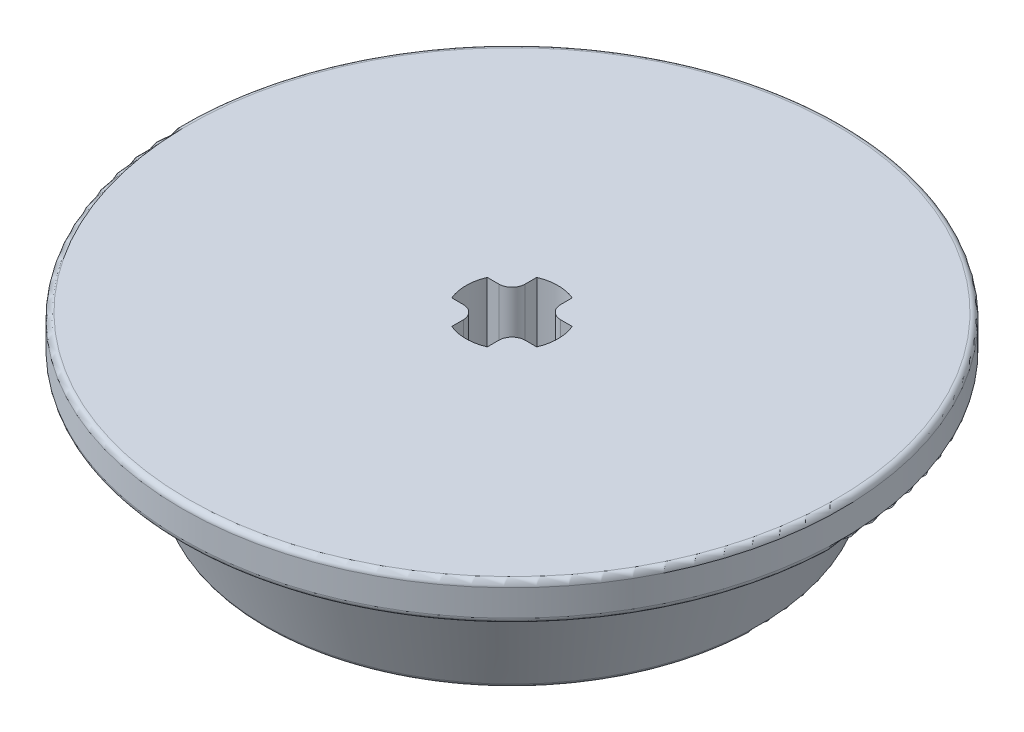
ISO-10303-21;
HEADER;
FILE_DESCRIPTION(('STEP AP214'),'2;1');
FILE_NAME('part.step','',(''),(''),'','','');
FILE_SCHEMA(('AUTOMOTIVE_DESIGN { 1 0 10303 214 1 1 1 1 }'));
ENDSEC;
DATA;
#1=APPLICATION_CONTEXT('core data for automotive mechanical design processes');
#2=APPLICATION_PROTOCOL_DEFINITION('international standard','automotive_design',2000,#1);
#3=PRODUCT_CONTEXT('',#1,'mechanical');
#4=PRODUCT('Part','Part','',(#3));
#5=PRODUCT_RELATED_PRODUCT_CATEGORY('part','',(#4));
#6=PRODUCT_DEFINITION_FORMATION('','',#4);
#7=PRODUCT_DEFINITION_CONTEXT('part definition',#1,'design');
#8=PRODUCT_DEFINITION('design','',#6,#7);
#9=PRODUCT_DEFINITION_SHAPE('','',#8);
#10=(LENGTH_UNIT() NAMED_UNIT(*) SI_UNIT(.MILLI.,.METRE.));
#11=(NAMED_UNIT(*) PLANE_ANGLE_UNIT() SI_UNIT($,.RADIAN.));
#12=(NAMED_UNIT(*) SI_UNIT($,.STERADIAN.) SOLID_ANGLE_UNIT());
#13=UNCERTAINTY_MEASURE_WITH_UNIT(LENGTH_MEASURE(1.E-05),#10,'distance_accuracy_value','');
#14=(GEOMETRIC_REPRESENTATION_CONTEXT(3) GLOBAL_UNCERTAINTY_ASSIGNED_CONTEXT((#13)) GLOBAL_UNIT_ASSIGNED_CONTEXT((#10,
#11,#12)) REPRESENTATION_CONTEXT('',''));
#15=CARTESIAN_POINT('',(0.,0.,0.));
#16=DIRECTION('',(0.,0.,1.));
#17=DIRECTION('',(1.,0.,0.));
#18=AXIS2_PLACEMENT_3D('',#15,#16,#17);
#19=CARTESIAN_POINT('',(0.,0.,0.));
#20=DIRECTION('',(0.,1.,0.));
#21=DIRECTION('',(0.,0.,1.));
#22=AXIS2_PLACEMENT_3D('',#19,#20,#21);
#23=PLANE('',#22);
#24=CARTESIAN_POINT('',(0.,0.,0.));
#25=DIRECTION('',(0.,1.,0.));
#26=DIRECTION('',(0.,0.,1.));
#27=AXIS2_PLACEMENT_3D('',#24,#25,#26);
#28=CIRCLE('',#27,17.1604709958205);
#29=CARTESIAN_POINT('',(0.,0.,17.1604709958205));
#30=VERTEX_POINT('',#29);
#31=EDGE_CURVE('E293',#30,#30,#28,.T.);
#32=ORIENTED_EDGE('',*,*,#31,.T.);
#33=EDGE_LOOP('',(#32));
#34=FACE_BOUND('',#33,.T.);
#35=DIRECTION('',(0.,0.,1.));
#36=VECTOR('',#35,1.);
#37=CARTESIAN_POINT('',(-0.940000000000001,0.,0.940000000000009));
#38=LINE('',#37,#36);
#39=CARTESIAN_POINT('',(-0.940000000000001,0.,1.64000000000001));
#40=VERTEX_POINT('',#39);
#41=CARTESIAN_POINT('',(-0.94,0.,2.25166604983954));
#42=VERTEX_POINT('',#41);
#43=EDGE_CURVE('E210',#40,#42,#38,.T.);
#44=ORIENTED_EDGE('',*,*,#43,.F.);
#45=CARTESIAN_POINT('',(-1.64,0.,1.64000000000001));
#46=DIRECTION('',(0.,1.,0.));
#47=DIRECTION('',(0.,0.,1.));
#48=AXIS2_PLACEMENT_3D('',#45,#46,#47);
#49=CIRCLE('',#48,0.7);
#50=CARTESIAN_POINT('',(-1.64,0.,0.940000000000009));
#51=VERTEX_POINT('',#50);
#52=EDGE_CURVE('E254',#40,#51,#49,.T.);
#53=ORIENTED_EDGE('',*,*,#52,.T.);
#54=DIRECTION('',(1.,0.,0.));
#55=VECTOR('',#54,1.);
#56=CARTESIAN_POINT('',(-2.25166604983954,0.,0.940000000000009));
#57=LINE('',#56,#55);
#58=CARTESIAN_POINT('',(-2.25166604983954,0.,0.940000000000008));
#59=VERTEX_POINT('',#58);
#60=EDGE_CURVE('E208',#59,#51,#57,.T.);
#61=ORIENTED_EDGE('',*,*,#60,.F.);
#62=CARTESIAN_POINT('',(0.,0.,0.));
#63=DIRECTION('',(0.,1.,0.));
#64=DIRECTION('',(0.,0.,1.));
#65=AXIS2_PLACEMENT_3D('',#62,#63,#64);
#66=CIRCLE('',#65,2.44);
#67=CARTESIAN_POINT('',(-2.25166604983954,0.,-0.940000000000009));
#68=VERTEX_POINT('',#67);
#69=EDGE_CURVE('E160',#68,#59,#66,.T.);
#70=ORIENTED_EDGE('',*,*,#69,.F.);
#71=DIRECTION('',(-1.,0.,0.));
#72=VECTOR('',#71,1.);
#73=CARTESIAN_POINT('',(-0.94,0.,-0.940000000000009));
#74=LINE('',#73,#72);
#75=CARTESIAN_POINT('',(-1.64,0.,-0.940000000000009));
#76=VERTEX_POINT('',#75);
#77=EDGE_CURVE('E205',#76,#68,#74,.T.);
#78=ORIENTED_EDGE('',*,*,#77,.F.);
#79=CARTESIAN_POINT('',(-1.64,0.,-1.64000000000001));
#80=DIRECTION('',(0.,1.,0.));
#81=DIRECTION('',(0.,0.,1.));
#82=AXIS2_PLACEMENT_3D('',#79,#80,#81);
#83=CIRCLE('',#82,0.7);
#84=CARTESIAN_POINT('',(-0.94,0.,-1.64000000000001));
#85=VERTEX_POINT('',#84);
#86=EDGE_CURVE('E248',#76,#85,#83,.T.);
#87=ORIENTED_EDGE('',*,*,#86,.T.);
#88=DIRECTION('',(0.,0.,1.));
#89=VECTOR('',#88,1.);
#90=CARTESIAN_POINT('',(-0.94,0.,-2.25166604983954));
#91=LINE('',#90,#89);
#92=CARTESIAN_POINT('',(-0.940000000000001,0.,-2.25166604983954));
#93=VERTEX_POINT('',#92);
#94=EDGE_CURVE('E202',#93,#85,#91,.T.);
#95=ORIENTED_EDGE('',*,*,#94,.F.);
#96=CARTESIAN_POINT('',(0.,0.,0.));
#97=DIRECTION('',(0.,1.,0.));
#98=DIRECTION('',(0.,0.,-1.));
#99=AXIS2_PLACEMENT_3D('',#96,#97,#98);
#100=CIRCLE('',#99,2.44);
#101=CARTESIAN_POINT('',(0.94,0.,-2.25166604983954));
#102=VERTEX_POINT('',#101);
#103=EDGE_CURVE('E227',#102,#93,#100,.T.);
#104=ORIENTED_EDGE('',*,*,#103,.F.);
#105=DIRECTION('',(0.,0.,-1.));
#106=VECTOR('',#105,1.);
#107=CARTESIAN_POINT('',(0.94,0.,-2.25166604983954));
#108=LINE('',#107,#106);
#109=CARTESIAN_POINT('',(0.94,0.,-1.64));
#110=VERTEX_POINT('',#109);
#111=EDGE_CURVE('E225',#110,#102,#108,.T.);
#112=ORIENTED_EDGE('',*,*,#111,.F.);
#113=CARTESIAN_POINT('',(1.64,0.,-1.64));
#114=DIRECTION('',(0.,1.,0.));
#115=DIRECTION('',(0.,0.,1.));
#116=AXIS2_PLACEMENT_3D('',#113,#114,#115);
#117=CIRCLE('',#116,0.7);
#118=CARTESIAN_POINT('',(1.64,0.,-0.940000000000003));
#119=VERTEX_POINT('',#118);
#120=EDGE_CURVE('E250',#110,#119,#117,.T.);
#121=ORIENTED_EDGE('',*,*,#120,.T.);
#122=DIRECTION('',(-1.,0.,0.));
#123=VECTOR('',#122,1.);
#124=CARTESIAN_POINT('',(0.94,0.,-0.940000000000003));
#125=LINE('',#124,#123);
#126=CARTESIAN_POINT('',(2.25166604983954,0.,-0.940000000000003));
#127=VERTEX_POINT('',#126);
#128=EDGE_CURVE('E223',#127,#119,#125,.T.);
#129=ORIENTED_EDGE('',*,*,#128,.F.);
#130=CARTESIAN_POINT('',(0.,0.,0.));
#131=DIRECTION('',(0.,1.,0.));
#132=DIRECTION('',(0.,0.,-1.));
#133=AXIS2_PLACEMENT_3D('',#130,#131,#132);
#134=CIRCLE('',#133,2.44);
#135=CARTESIAN_POINT('',(2.25166604983954,0.,0.940000000000003));
#136=VERTEX_POINT('',#135);
#137=EDGE_CURVE('E220',#136,#127,#134,.T.);
#138=ORIENTED_EDGE('',*,*,#137,.F.);
#139=DIRECTION('',(1.,0.,0.));
#140=VECTOR('',#139,1.);
#141=CARTESIAN_POINT('',(0.940000000000001,0.,0.940000000000003));
#142=LINE('',#141,#140);
#143=CARTESIAN_POINT('',(1.64,0.,0.940000000000003));
#144=VERTEX_POINT('',#143);
#145=EDGE_CURVE('E218',#144,#136,#142,.T.);
#146=ORIENTED_EDGE('',*,*,#145,.F.);
#147=CARTESIAN_POINT('',(1.64,0.,1.64));
#148=DIRECTION('',(0.,1.,0.));
#149=DIRECTION('',(0.,0.,1.));
#150=AXIS2_PLACEMENT_3D('',#147,#148,#149);
#151=CIRCLE('',#150,0.7);
#152=CARTESIAN_POINT('',(0.940000000000001,0.,1.64));
#153=VERTEX_POINT('',#152);
#154=EDGE_CURVE('E252',#144,#153,#151,.T.);
#155=ORIENTED_EDGE('',*,*,#154,.T.);
#156=DIRECTION('',(0.,0.,-1.));
#157=VECTOR('',#156,1.);
#158=CARTESIAN_POINT('',(0.940000000000001,0.,2.25166604983954));
#159=LINE('',#158,#157);
#160=CARTESIAN_POINT('',(0.94,0.,2.25166604983954));
#161=VERTEX_POINT('',#160);
#162=EDGE_CURVE('E215',#161,#153,#159,.T.);
#163=ORIENTED_EDGE('',*,*,#162,.F.);
#164=CARTESIAN_POINT('',(0.,0.,0.));
#165=DIRECTION('',(0.,1.,0.));
#166=DIRECTION('',(0.,0.,1.));
#167=AXIS2_PLACEMENT_3D('',#164,#165,#166);
#168=CIRCLE('',#167,2.44);
#169=EDGE_CURVE('E212',#42,#161,#168,.T.);
#170=ORIENTED_EDGE('',*,*,#169,.F.);
#171=EDGE_LOOP('',(#44,#53,#61,#70,#78,#87,#95,#104,#112,#121,#129,#138,#146,#155,#163,#170));
#172=FACE_BOUND('',#171,.T.);
#173=ADVANCED_FACE('F37',(#34,#172),#23,.T.);
#174=CARTESIAN_POINT('',(0.,0.,0.));
#175=DIRECTION('',(0.,-1.,0.));
#176=DIRECTION('',(0.,0.,-1.));
#177=AXIS2_PLACEMENT_3D('',#174,#175,#176);
#178=CYLINDRICAL_SURFACE('',#177,17.4604709958205);
#179=CARTESIAN_POINT('',(0.,-0.3,0.));
#180=DIRECTION('',(0.,1.,0.));
#181=DIRECTION('',(0.,0.,1.));
#182=AXIS2_PLACEMENT_3D('',#179,#180,#181);
#183=CIRCLE('',#182,17.4604709958205);
#184=CARTESIAN_POINT('',(0.,-0.3,17.4604709958205));
#185=VERTEX_POINT('',#184);
#186=EDGE_CURVE('E290',#185,#185,#183,.F.);
#187=ORIENTED_EDGE('',*,*,#186,.T.);
#188=EDGE_LOOP('',(#187));
#189=FACE_BOUND('',#188,.T.);
#190=CARTESIAN_POINT('',(0.,-1.7,0.));
#191=DIRECTION('',(0.,-1.,0.));
#192=DIRECTION('',(0.,0.,-1.));
#193=AXIS2_PLACEMENT_3D('',#190,#191,#192);
#194=CIRCLE('',#193,17.4604709958205);
#195=CARTESIAN_POINT('',(0.,-1.7,-17.4604709958205));
#196=VERTEX_POINT('',#195);
#197=EDGE_CURVE('E287',#196,#196,#194,.F.);
#198=ORIENTED_EDGE('',*,*,#197,.T.);
#199=EDGE_LOOP('',(#198));
#200=FACE_BOUND('',#199,.T.);
#201=ADVANCED_FACE('F310',(#189,#200),#178,.T.);
#202=CARTESIAN_POINT('',(17.4604709958205,-2.,0.));
#203=DIRECTION('',(0.,-1.,0.));
#204=DIRECTION('',(0.,0.,-1.));
#205=AXIS2_PLACEMENT_3D('',#202,#203,#204);
#206=PLANE('',#205);
#207=CARTESIAN_POINT('',(0.,-2.,0.));
#208=DIRECTION('',(0.,-1.,0.));
#209=DIRECTION('',(0.,0.,-1.));
#210=AXIS2_PLACEMENT_3D('',#207,#208,#209);
#211=CIRCLE('',#210,15.217962758402);
#212=CARTESIAN_POINT('',(0.,-2.,-15.217962758402));
#213=VERTEX_POINT('',#212);
#214=EDGE_CURVE('E11',#213,#213,#211,.F.);
#215=ORIENTED_EDGE('',*,*,#214,.T.);
#216=EDGE_LOOP('',(#215));
#217=FACE_BOUND('',#216,.T.);
#218=CARTESIAN_POINT('',(0.,-2.,0.));
#219=DIRECTION('',(0.,-1.,0.));
#220=DIRECTION('',(0.,0.,-1.));
#221=AXIS2_PLACEMENT_3D('',#218,#219,#220);
#222=CIRCLE('',#221,17.1604709958205);
#223=CARTESIAN_POINT('',(0.,-2.,-17.1604709958205));
#224=VERTEX_POINT('',#223);
#225=EDGE_CURVE('E45',#224,#224,#222,.T.);
#226=ORIENTED_EDGE('',*,*,#225,.T.);
#227=EDGE_LOOP('',(#226));
#228=FACE_BOUND('',#227,.T.);
#229=ADVANCED_FACE('F298',(#217,#228),#206,.T.);
#230=CARTESIAN_POINT('',(0.,-8.,0.));
#231=DIRECTION('',(0.,1.,0.));
#232=DIRECTION('',(0.,0.,1.));
#233=AXIS2_PLACEMENT_3D('',#230,#231,#232);
#234=CONICAL_SURFACE('',#233,13.0504818226145,0.314159265357181);
#235=CARTESIAN_POINT('',(0.,-7.79270509831196,0.));
#236=DIRECTION('',(0.,-1.,0.));
#237=DIRECTION('',(0.,0.,-1.));
#238=AXIS2_PLACEMENT_3D('',#235,#236,#237);
#239=CIRCLE('',#238,13.1178360191012);
#240=CARTESIAN_POINT('',(0.,-7.79270509831196,-13.1178360191012));
#241=VERTEX_POINT('',#240);
#242=EDGE_CURVE('E284',#241,#241,#239,.F.);
#243=ORIENTED_EDGE('',*,*,#242,.T.);
#244=EDGE_LOOP('',(#243));
#245=FACE_BOUND('',#244,.T.);
#246=CARTESIAN_POINT('',(0.,-2.20729490168803,0.));
#247=DIRECTION('',(0.,1.,0.));
#248=DIRECTION('',(0.,0.,1.));
#249=AXIS2_PLACEMENT_3D('',#246,#247,#248);
#250=CIRCLE('',#249,14.9326458035133);
#251=CARTESIAN_POINT('',(0.,-2.20729490168803,14.9326458035133));
#252=VERTEX_POINT('',#251);
#253=EDGE_CURVE('E281',#252,#252,#250,.F.);
#254=ORIENTED_EDGE('',*,*,#253,.T.);
#255=EDGE_LOOP('',(#254));
#256=FACE_BOUND('',#255,.T.);
#257=ADVANCED_FACE('F520',(#245,#256),#234,.T.);
#258=CARTESIAN_POINT('',(13.0504818226145,-8.,0.));
#259=DIRECTION('',(0.,-1.,0.));
#260=DIRECTION('',(0.,0.,-1.));
#261=AXIS2_PLACEMENT_3D('',#258,#259,#260);
#262=PLANE('',#261);
#263=CARTESIAN_POINT('',(0.,-8.,0.));
#264=DIRECTION('',(0.,-1.,0.));
#265=DIRECTION('',(0.,0.,-1.));
#266=AXIS2_PLACEMENT_3D('',#263,#264,#265);
#267=CIRCLE('',#266,12.8325190642125);
#268=CARTESIAN_POINT('',(0.,-8.,-12.8325190642125));
#269=VERTEX_POINT('',#268);
#270=EDGE_CURVE('E278',#269,#269,#267,.T.);
#271=ORIENTED_EDGE('',*,*,#270,.T.);
#272=EDGE_LOOP('',(#271));
#273=FACE_BOUND('',#272,.T.);
#274=DIRECTION('',(1.,0.,0.));
#275=VECTOR('',#274,1.);
#276=CARTESIAN_POINT('',(-2.25166604983954,-8.,0.940000000000009));
#277=LINE('',#276,#275);
#278=CARTESIAN_POINT('',(-2.25166604983954,-8.,0.940000000000008));
#279=VERTEX_POINT('',#278);
#280=CARTESIAN_POINT('',(-1.64,-8.,0.940000000000009));
#281=VERTEX_POINT('',#280);
#282=EDGE_CURVE('E168',#279,#281,#277,.T.);
#283=ORIENTED_EDGE('',*,*,#282,.T.);
#284=CARTESIAN_POINT('',(-1.64,-8.,1.64000000000001));
#285=DIRECTION('',(0.,-1.,0.));
#286=DIRECTION('',(0.,0.,-1.));
#287=AXIS2_PLACEMENT_3D('',#284,#285,#286);
#288=CIRCLE('',#287,0.7);
#289=CARTESIAN_POINT('',(-0.940000000000001,-8.,1.64000000000001));
#290=VERTEX_POINT('',#289);
#291=EDGE_CURVE('E262',#281,#290,#288,.T.);
#292=ORIENTED_EDGE('',*,*,#291,.T.);
#293=DIRECTION('',(0.,0.,1.));
#294=VECTOR('',#293,1.);
#295=CARTESIAN_POINT('',(-0.940000000000001,-8.,0.940000000000009));
#296=LINE('',#295,#294);
#297=CARTESIAN_POINT('',(-0.94,-8.,2.25166604983954));
#298=VERTEX_POINT('',#297);
#299=EDGE_CURVE('E173',#290,#298,#296,.T.);
#300=ORIENTED_EDGE('',*,*,#299,.T.);
#301=CARTESIAN_POINT('',(0.,-8.,0.));
#302=DIRECTION('',(0.,1.,0.));
#303=DIRECTION('',(0.,0.,1.));
#304=AXIS2_PLACEMENT_3D('',#301,#302,#303);
#305=CIRCLE('',#304,2.44);
#306=CARTESIAN_POINT('',(0.94,-8.,2.25166604983954));
#307=VERTEX_POINT('',#306);
#308=EDGE_CURVE('E184',#298,#307,#305,.T.);
#309=ORIENTED_EDGE('',*,*,#308,.T.);
#310=DIRECTION('',(0.,0.,-1.));
#311=VECTOR('',#310,1.);
#312=CARTESIAN_POINT('',(0.940000000000001,-8.,2.25166604983954));
#313=LINE('',#312,#311);
#314=CARTESIAN_POINT('',(0.940000000000001,-8.,1.64));
#315=VERTEX_POINT('',#314);
#316=EDGE_CURVE('E187',#307,#315,#313,.T.);
#317=ORIENTED_EDGE('',*,*,#316,.T.);
#318=CARTESIAN_POINT('',(1.64,-8.,1.64));
#319=DIRECTION('',(0.,-1.,0.));
#320=DIRECTION('',(0.,0.,-1.));
#321=AXIS2_PLACEMENT_3D('',#318,#319,#320);
#322=CIRCLE('',#321,0.7);
#323=CARTESIAN_POINT('',(1.64,-8.,0.940000000000003));
#324=VERTEX_POINT('',#323);
#325=EDGE_CURVE('E260',#315,#324,#322,.T.);
#326=ORIENTED_EDGE('',*,*,#325,.T.);
#327=DIRECTION('',(1.,0.,0.));
#328=VECTOR('',#327,1.);
#329=CARTESIAN_POINT('',(0.940000000000001,-8.,0.940000000000003));
#330=LINE('',#329,#328);
#331=CARTESIAN_POINT('',(2.25166604983954,-8.,0.940000000000003));
#332=VERTEX_POINT('',#331);
#333=EDGE_CURVE('E190',#324,#332,#330,.T.);
#334=ORIENTED_EDGE('',*,*,#333,.T.);
#335=CARTESIAN_POINT('',(0.,-8.,0.));
#336=DIRECTION('',(0.,1.,0.));
#337=DIRECTION('',(0.,0.,-1.));
#338=AXIS2_PLACEMENT_3D('',#335,#336,#337);
#339=CIRCLE('',#338,2.44);
#340=CARTESIAN_POINT('',(2.25166604983954,-8.,-0.940000000000003));
#341=VERTEX_POINT('',#340);
#342=EDGE_CURVE('E192',#332,#341,#339,.T.);
#343=ORIENTED_EDGE('',*,*,#342,.T.);
#344=DIRECTION('',(-1.,0.,0.));
#345=VECTOR('',#344,1.);
#346=CARTESIAN_POINT('',(0.94,-8.,-0.940000000000003));
#347=LINE('',#346,#345);
#348=CARTESIAN_POINT('',(1.64,-8.,-0.940000000000003));
#349=VERTEX_POINT('',#348);
#350=EDGE_CURVE('E195',#341,#349,#347,.T.);
#351=ORIENTED_EDGE('',*,*,#350,.T.);
#352=CARTESIAN_POINT('',(1.64,-8.,-1.64));
#353=DIRECTION('',(0.,-1.,0.));
#354=DIRECTION('',(0.,0.,-1.));
#355=AXIS2_PLACEMENT_3D('',#352,#353,#354);
#356=CIRCLE('',#355,0.7);
#357=CARTESIAN_POINT('',(0.94,-8.,-1.64));
#358=VERTEX_POINT('',#357);
#359=EDGE_CURVE('E52',#349,#358,#356,.T.);
#360=ORIENTED_EDGE('',*,*,#359,.T.);
#361=DIRECTION('',(0.,0.,-1.));
#362=VECTOR('',#361,1.);
#363=CARTESIAN_POINT('',(0.94,-8.,-2.25166604983954));
#364=LINE('',#363,#362);
#365=CARTESIAN_POINT('',(0.94,-8.,-2.25166604983954));
#366=VERTEX_POINT('',#365);
#367=EDGE_CURVE('E197',#358,#366,#364,.T.);
#368=ORIENTED_EDGE('',*,*,#367,.T.);
#369=CARTESIAN_POINT('',(0.,-8.,0.));
#370=DIRECTION('',(0.,1.,0.));
#371=DIRECTION('',(0.,0.,-1.));
#372=AXIS2_PLACEMENT_3D('',#369,#370,#371);
#373=CIRCLE('',#372,2.44);
#374=CARTESIAN_POINT('',(-0.940000000000001,-8.,-2.25166604983954));
#375=VERTEX_POINT('',#374);
#376=EDGE_CURVE('E199',#366,#375,#373,.T.);
#377=ORIENTED_EDGE('',*,*,#376,.T.);
#378=DIRECTION('',(0.,0.,1.));
#379=VECTOR('',#378,1.);
#380=CARTESIAN_POINT('',(-0.94,-8.,-2.25166604983954));
#381=LINE('',#380,#379);
#382=CARTESIAN_POINT('',(-0.94,-8.,-1.64000000000001));
#383=VERTEX_POINT('',#382);
#384=EDGE_CURVE('E179',#375,#383,#381,.T.);
#385=ORIENTED_EDGE('',*,*,#384,.T.);
#386=CARTESIAN_POINT('',(-1.64,-8.,-1.64000000000001));
#387=DIRECTION('',(0.,-1.,0.));
#388=DIRECTION('',(0.,0.,-1.));
#389=AXIS2_PLACEMENT_3D('',#386,#387,#388);
#390=CIRCLE('',#389,0.7);
#391=CARTESIAN_POINT('',(-1.64,-8.,-0.940000000000009));
#392=VERTEX_POINT('',#391);
#393=EDGE_CURVE('E257',#383,#392,#390,.T.);
#394=ORIENTED_EDGE('',*,*,#393,.T.);
#395=DIRECTION('',(-1.,0.,0.));
#396=VECTOR('',#395,1.);
#397=CARTESIAN_POINT('',(-0.94,-8.,-0.940000000000009));
#398=LINE('',#397,#396);
#399=CARTESIAN_POINT('',(-2.25166604983954,-8.,-0.940000000000009));
#400=VERTEX_POINT('',#399);
#401=EDGE_CURVE('E177',#392,#400,#398,.T.);
#402=ORIENTED_EDGE('',*,*,#401,.T.);
#403=CARTESIAN_POINT('',(0.,-8.,0.));
#404=DIRECTION('',(0.,1.,0.));
#405=DIRECTION('',(0.,0.,1.));
#406=AXIS2_PLACEMENT_3D('',#403,#404,#405);
#407=CIRCLE('',#406,2.44);
#408=EDGE_CURVE('E157',#400,#279,#407,.T.);
#409=ORIENTED_EDGE('',*,*,#408,.T.);
#410=EDGE_LOOP('',(#283,#292,#300,#309,#317,#326,#334,#343,#351,#360,#368,#377,#385,#394,#402,#409));
#411=FACE_BOUND('',#410,.T.);
#412=ADVANCED_FACE('F175',(#273,#411),#262,.T.);
#413=CARTESIAN_POINT('',(-0.94,-8.,-2.25166604983954));
#414=DIRECTION('',(-1.,0.,0.));
#415=DIRECTION('',(0.,0.,1.));
#416=AXIS2_PLACEMENT_3D('',#413,#414,#415);
#417=PLANE('',#416);
#418=ORIENTED_EDGE('',*,*,#94,.T.);
#419=DIRECTION('',(0.,1.,0.));
#420=VECTOR('',#419,1.);
#421=CARTESIAN_POINT('',(-0.94,-8.,-1.64000000000001));
#422=LINE('',#421,#420);
#423=EDGE_CURVE('E276',#85,#383,#422,.F.);
#424=ORIENTED_EDGE('',*,*,#423,.T.);
#425=ORIENTED_EDGE('',*,*,#384,.F.);
#426=DIRECTION('',(0.,1.,0.));
#427=VECTOR('',#426,1.);
#428=CARTESIAN_POINT('',(-0.940000000000001,-8.,-2.25166604983954));
#429=LINE('',#428,#427);
#430=EDGE_CURVE('E230',#375,#93,#429,.T.);
#431=ORIENTED_EDGE('',*,*,#430,.T.);
#432=EDGE_LOOP('',(#418,#424,#425,#431));
#433=FACE_BOUND('',#432,.T.);
#434=ADVANCED_FACE('F501',(#433),#417,.F.);
#435=CARTESIAN_POINT('',(0.,-8.,0.));
#436=DIRECTION('',(0.,1.,0.));
#437=DIRECTION('',(0.,0.,1.));
#438=AXIS2_PLACEMENT_3D('',#435,#436,#437);
#439=CYLINDRICAL_SURFACE('',#438,2.44);
#440=ORIENTED_EDGE('',*,*,#103,.T.);
#441=ORIENTED_EDGE('',*,*,#430,.F.);
#442=ORIENTED_EDGE('',*,*,#376,.F.);
#443=DIRECTION('',(0.,1.,0.));
#444=VECTOR('',#443,1.);
#445=CARTESIAN_POINT('',(0.94,-8.,-2.25166604983954));
#446=LINE('',#445,#444);
#447=EDGE_CURVE('E233',#366,#102,#446,.T.);
#448=ORIENTED_EDGE('',*,*,#447,.T.);
#449=EDGE_LOOP('',(#440,#441,#442,#448));
#450=FACE_BOUND('',#449,.T.);
#451=ADVANCED_FACE('F491',(#450),#439,.F.);
#452=CARTESIAN_POINT('',(0.94,-8.,-2.25166604983954));
#453=DIRECTION('',(1.,0.,0.));
#454=DIRECTION('',(0.,0.,-1.));
#455=AXIS2_PLACEMENT_3D('',#452,#453,#454);
#456=PLANE('',#455);
#457=ORIENTED_EDGE('',*,*,#367,.F.);
#458=DIRECTION('',(0.,1.,0.));
#459=VECTOR('',#458,1.);
#460=CARTESIAN_POINT('',(0.94,-8.,-1.64));
#461=LINE('',#460,#459);
#462=EDGE_CURVE('E269',#358,#110,#461,.T.);
#463=ORIENTED_EDGE('',*,*,#462,.T.);
#464=ORIENTED_EDGE('',*,*,#111,.T.);
#465=ORIENTED_EDGE('',*,*,#447,.F.);
#466=EDGE_LOOP('',(#457,#463,#464,#465));
#467=FACE_BOUND('',#466,.T.);
#468=ADVANCED_FACE('F482',(#467),#456,.F.);
#469=CARTESIAN_POINT('',(0.94,-8.,-0.940000000000003));
#470=DIRECTION('',(0.,0.,-1.));
#471=DIRECTION('',(-1.,0.,0.));
#472=AXIS2_PLACEMENT_3D('',#469,#470,#471);
#473=PLANE('',#472);
#474=ORIENTED_EDGE('',*,*,#128,.T.);
#475=DIRECTION('',(0.,1.,0.));
#476=VECTOR('',#475,1.);
#477=CARTESIAN_POINT('',(1.64,-8.,-0.940000000000003));
#478=LINE('',#477,#476);
#479=EDGE_CURVE('E60',#119,#349,#478,.F.);
#480=ORIENTED_EDGE('',*,*,#479,.T.);
#481=ORIENTED_EDGE('',*,*,#350,.F.);
#482=DIRECTION('',(0.,1.,0.));
#483=VECTOR('',#482,1.);
#484=CARTESIAN_POINT('',(2.25166604983954,-8.,-0.940000000000003));
#485=LINE('',#484,#483);
#486=EDGE_CURVE('E236',#341,#127,#485,.T.);
#487=ORIENTED_EDGE('',*,*,#486,.T.);
#488=EDGE_LOOP('',(#474,#480,#481,#487));
#489=FACE_BOUND('',#488,.T.);
#490=ADVANCED_FACE('F472',(#489),#473,.F.);
#491=CARTESIAN_POINT('',(0.,-8.,0.));
#492=DIRECTION('',(0.,1.,0.));
#493=DIRECTION('',(0.,0.,1.));
#494=AXIS2_PLACEMENT_3D('',#491,#492,#493);
#495=CYLINDRICAL_SURFACE('',#494,2.44);
#496=ORIENTED_EDGE('',*,*,#137,.T.);
#497=ORIENTED_EDGE('',*,*,#486,.F.);
#498=ORIENTED_EDGE('',*,*,#342,.F.);
#499=DIRECTION('',(0.,1.,0.));
#500=VECTOR('',#499,1.);
#501=CARTESIAN_POINT('',(2.25166604983954,-8.,0.940000000000003));
#502=LINE('',#501,#500);
#503=EDGE_CURVE('E238',#332,#136,#502,.T.);
#504=ORIENTED_EDGE('',*,*,#503,.T.);
#505=EDGE_LOOP('',(#496,#497,#498,#504));
#506=FACE_BOUND('',#505,.T.);
#507=ADVANCED_FACE('F462',(#506),#495,.F.);
#508=CARTESIAN_POINT('',(0.940000000000001,-8.,0.940000000000003));
#509=DIRECTION('',(0.,0.,1.));
#510=DIRECTION('',(1.,0.,0.));
#511=AXIS2_PLACEMENT_3D('',#508,#509,#510);
#512=PLANE('',#511);
#513=ORIENTED_EDGE('',*,*,#333,.F.);
#514=DIRECTION('',(0.,1.,0.));
#515=VECTOR('',#514,1.);
#516=CARTESIAN_POINT('',(1.64,-8.,0.940000000000003));
#517=LINE('',#516,#515);
#518=EDGE_CURVE('E264',#324,#144,#517,.T.);
#519=ORIENTED_EDGE('',*,*,#518,.T.);
#520=ORIENTED_EDGE('',*,*,#145,.T.);
#521=ORIENTED_EDGE('',*,*,#503,.F.);
#522=EDGE_LOOP('',(#513,#519,#520,#521));
#523=FACE_BOUND('',#522,.T.);
#524=ADVANCED_FACE('F452',(#523),#512,.F.);
#525=CARTESIAN_POINT('',(0.940000000000001,-8.,2.25166604983954));
#526=DIRECTION('',(1.,0.,0.));
#527=DIRECTION('',(0.,0.,-1.));
#528=AXIS2_PLACEMENT_3D('',#525,#526,#527);
#529=PLANE('',#528);
#530=ORIENTED_EDGE('',*,*,#162,.T.);
#531=DIRECTION('',(0.,1.,0.));
#532=VECTOR('',#531,1.);
#533=CARTESIAN_POINT('',(0.940000000000001,-8.,1.64));
#534=LINE('',#533,#532);
#535=EDGE_CURVE('E267',#153,#315,#534,.F.);
#536=ORIENTED_EDGE('',*,*,#535,.T.);
#537=ORIENTED_EDGE('',*,*,#316,.F.);
#538=DIRECTION('',(0.,1.,0.));
#539=VECTOR('',#538,1.);
#540=CARTESIAN_POINT('',(0.94,-8.,2.25166604983954));
#541=LINE('',#540,#539);
#542=EDGE_CURVE('E241',#307,#161,#541,.T.);
#543=ORIENTED_EDGE('',*,*,#542,.T.);
#544=EDGE_LOOP('',(#530,#536,#537,#543));
#545=FACE_BOUND('',#544,.T.);
#546=ADVANCED_FACE('F442',(#545),#529,.F.);
#547=CARTESIAN_POINT('',(0.,-8.,0.));
#548=DIRECTION('',(0.,1.,0.));
#549=DIRECTION('',(0.,0.,1.));
#550=AXIS2_PLACEMENT_3D('',#547,#548,#549);
#551=CYLINDRICAL_SURFACE('',#550,2.44);
#552=ORIENTED_EDGE('',*,*,#169,.T.);
#553=ORIENTED_EDGE('',*,*,#542,.F.);
#554=ORIENTED_EDGE('',*,*,#308,.F.);
#555=DIRECTION('',(0.,1.,0.));
#556=VECTOR('',#555,1.);
#557=CARTESIAN_POINT('',(-0.94,-8.,2.25166604983954));
#558=LINE('',#557,#556);
#559=EDGE_CURVE('E164',#298,#42,#558,.T.);
#560=ORIENTED_EDGE('',*,*,#559,.T.);
#561=EDGE_LOOP('',(#552,#553,#554,#560));
#562=FACE_BOUND('',#561,.T.);
#563=ADVANCED_FACE('F432',(#562),#551,.F.);
#564=CARTESIAN_POINT('',(-0.940000000000001,-8.,0.940000000000009));
#565=DIRECTION('',(-1.,0.,0.));
#566=DIRECTION('',(0.,0.,1.));
#567=AXIS2_PLACEMENT_3D('',#564,#565,#566);
#568=PLANE('',#567);
#569=ORIENTED_EDGE('',*,*,#299,.F.);
#570=DIRECTION('',(0.,1.,0.));
#571=VECTOR('',#570,1.);
#572=CARTESIAN_POINT('',(-0.940000000000001,-8.,1.64000000000001));
#573=LINE('',#572,#571);
#574=EDGE_CURVE('E232',#290,#40,#573,.T.);
#575=ORIENTED_EDGE('',*,*,#574,.T.);
#576=ORIENTED_EDGE('',*,*,#43,.T.);
#577=ORIENTED_EDGE('',*,*,#559,.F.);
#578=EDGE_LOOP('',(#569,#575,#576,#577));
#579=FACE_BOUND('',#578,.T.);
#580=ADVANCED_FACE('F423',(#579),#568,.F.);
#581=CARTESIAN_POINT('',(-2.25166604983954,-8.,0.940000000000009));
#582=DIRECTION('',(0.,0.,1.));
#583=DIRECTION('',(1.,0.,0.));
#584=AXIS2_PLACEMENT_3D('',#581,#582,#583);
#585=PLANE('',#584);
#586=ORIENTED_EDGE('',*,*,#60,.T.);
#587=DIRECTION('',(0.,1.,0.));
#588=VECTOR('',#587,1.);
#589=CARTESIAN_POINT('',(-1.64,-8.,0.940000000000009));
#590=LINE('',#589,#588);
#591=EDGE_CURVE('E171',#51,#281,#590,.F.);
#592=ORIENTED_EDGE('',*,*,#591,.T.);
#593=ORIENTED_EDGE('',*,*,#282,.F.);
#594=DIRECTION('',(0.,1.,0.));
#595=VECTOR('',#594,1.);
#596=CARTESIAN_POINT('',(-2.25166604983954,-8.,0.940000000000008));
#597=LINE('',#596,#595);
#598=EDGE_CURVE('E152',#279,#59,#597,.T.);
#599=ORIENTED_EDGE('',*,*,#598,.T.);
#600=EDGE_LOOP('',(#586,#592,#593,#599));
#601=FACE_BOUND('',#600,.T.);
#602=ADVANCED_FACE('F169',(#601),#585,.F.);
#603=CARTESIAN_POINT('',(0.,-8.,0.));
#604=DIRECTION('',(0.,1.,0.));
#605=DIRECTION('',(0.,0.,1.));
#606=AXIS2_PLACEMENT_3D('',#603,#604,#605);
#607=CYLINDRICAL_SURFACE('',#606,2.44);
#608=ORIENTED_EDGE('',*,*,#69,.T.);
#609=ORIENTED_EDGE('',*,*,#598,.F.);
#610=ORIENTED_EDGE('',*,*,#408,.F.);
#611=DIRECTION('',(0.,1.,0.));
#612=VECTOR('',#611,1.);
#613=CARTESIAN_POINT('',(-2.25166604983954,-8.,-0.940000000000009));
#614=LINE('',#613,#612);
#615=EDGE_CURVE('E165',#400,#68,#614,.T.);
#616=ORIENTED_EDGE('',*,*,#615,.T.);
#617=EDGE_LOOP('',(#608,#609,#610,#616));
#618=FACE_BOUND('',#617,.T.);
#619=ADVANCED_FACE('F154',(#618),#607,.F.);
#620=CARTESIAN_POINT('',(-0.94,-8.,-0.940000000000009));
#621=DIRECTION('',(0.,0.,-1.));
#622=DIRECTION('',(-1.,0.,0.));
#623=AXIS2_PLACEMENT_3D('',#620,#621,#622);
#624=PLANE('',#623);
#625=ORIENTED_EDGE('',*,*,#401,.F.);
#626=DIRECTION('',(0.,1.,0.));
#627=VECTOR('',#626,1.);
#628=CARTESIAN_POINT('',(-1.64,-8.,-0.940000000000009));
#629=LINE('',#628,#627);
#630=EDGE_CURVE('E273',#392,#76,#629,.T.);
#631=ORIENTED_EDGE('',*,*,#630,.T.);
#632=ORIENTED_EDGE('',*,*,#77,.T.);
#633=ORIENTED_EDGE('',*,*,#615,.F.);
#634=EDGE_LOOP('',(#625,#631,#632,#633));
#635=FACE_BOUND('',#634,.T.);
#636=ADVANCED_FACE('F325',(#635),#624,.F.);
#637=CARTESIAN_POINT('',(-1.64,-8.,1.64000000000001));
#638=DIRECTION('',(0.,1.,0.));
#639=DIRECTION('',(0.,0.,1.));
#640=AXIS2_PLACEMENT_3D('',#637,#638,#639);
#641=CYLINDRICAL_SURFACE('',#640,0.7);
#642=ORIENTED_EDGE('',*,*,#291,.F.);
#643=ORIENTED_EDGE('',*,*,#591,.F.);
#644=ORIENTED_EDGE('',*,*,#52,.F.);
#645=ORIENTED_EDGE('',*,*,#574,.F.);
#646=EDGE_LOOP('',(#642,#643,#644,#645));
#647=FACE_BOUND('',#646,.T.);
#648=ADVANCED_FACE('F321',(#647),#641,.T.);
#649=CARTESIAN_POINT('',(1.64,-8.,1.64));
#650=DIRECTION('',(0.,1.,0.));
#651=DIRECTION('',(0.,0.,1.));
#652=AXIS2_PLACEMENT_3D('',#649,#650,#651);
#653=CYLINDRICAL_SURFACE('',#652,0.7);
#654=ORIENTED_EDGE('',*,*,#325,.F.);
#655=ORIENTED_EDGE('',*,*,#535,.F.);
#656=ORIENTED_EDGE('',*,*,#154,.F.);
#657=ORIENTED_EDGE('',*,*,#518,.F.);
#658=EDGE_LOOP('',(#654,#655,#656,#657));
#659=FACE_BOUND('',#658,.T.);
#660=ADVANCED_FACE('F324',(#659),#653,.T.);
#661=CARTESIAN_POINT('',(1.64,-8.,-1.64));
#662=DIRECTION('',(0.,1.,0.));
#663=DIRECTION('',(0.,0.,1.));
#664=AXIS2_PLACEMENT_3D('',#661,#662,#663);
#665=CYLINDRICAL_SURFACE('',#664,0.7);
#666=ORIENTED_EDGE('',*,*,#359,.F.);
#667=ORIENTED_EDGE('',*,*,#479,.F.);
#668=ORIENTED_EDGE('',*,*,#120,.F.);
#669=ORIENTED_EDGE('',*,*,#462,.F.);
#670=EDGE_LOOP('',(#666,#667,#668,#669));
#671=FACE_BOUND('',#670,.T.);
#672=ADVANCED_FACE('F329',(#671),#665,.T.);
#673=CARTESIAN_POINT('',(-1.64,-8.,-1.64000000000001));
#674=DIRECTION('',(0.,1.,0.));
#675=DIRECTION('',(0.,0.,1.));
#676=AXIS2_PLACEMENT_3D('',#673,#674,#675);
#677=CYLINDRICAL_SURFACE('',#676,0.7);
#678=ORIENTED_EDGE('',*,*,#393,.F.);
#679=ORIENTED_EDGE('',*,*,#423,.F.);
#680=ORIENTED_EDGE('',*,*,#86,.F.);
#681=ORIENTED_EDGE('',*,*,#630,.F.);
#682=EDGE_LOOP('',(#678,#679,#680,#681));
#683=FACE_BOUND('',#682,.T.);
#684=ADVANCED_FACE('F333',(#683),#677,.T.);
#685=CARTESIAN_POINT('',(0.,-7.7,0.));
#686=DIRECTION('',(0.,-1.,0.));
#687=DIRECTION('',(0.,0.,-1.));
#688=AXIS2_PLACEMENT_3D('',#685,#686,#687);
#689=TOROIDAL_SURFACE('',#688,12.8325190642125,0.3);
#690=ORIENTED_EDGE('',*,*,#242,.F.);
#691=EDGE_LOOP('',(#690));
#692=FACE_BOUND('',#691,.T.);
#693=ORIENTED_EDGE('',*,*,#270,.F.);
#694=EDGE_LOOP('',(#693));
#695=FACE_BOUND('',#694,.T.);
#696=ADVANCED_FACE('F337',(#692,#695),#689,.T.);
#697=CARTESIAN_POINT('',(0.,-0.3,0.));
#698=DIRECTION('',(0.,1.,0.));
#699=DIRECTION('',(0.,0.,1.));
#700=AXIS2_PLACEMENT_3D('',#697,#698,#699);
#701=TOROIDAL_SURFACE('',#700,17.1604709958205,0.3);
#702=ORIENTED_EDGE('',*,*,#31,.F.);
#703=EDGE_LOOP('',(#702));
#704=FACE_BOUND('',#703,.T.);
#705=ORIENTED_EDGE('',*,*,#186,.F.);
#706=EDGE_LOOP('',(#705));
#707=FACE_BOUND('',#706,.T.);
#708=ADVANCED_FACE('F306',(#704,#707),#701,.T.);
#709=CARTESIAN_POINT('',(0.,-2.3,0.));
#710=DIRECTION('',(0.,-1.,0.));
#711=DIRECTION('',(0.,0.,-1.));
#712=AXIS2_PLACEMENT_3D('',#709,#710,#711);
#713=TOROIDAL_SURFACE('',#712,15.217962758402,0.3);
#714=ORIENTED_EDGE('',*,*,#214,.F.);
#715=EDGE_LOOP('',(#714));
#716=FACE_BOUND('',#715,.T.);
#717=ORIENTED_EDGE('',*,*,#253,.F.);
#718=EDGE_LOOP('',(#717));
#719=FACE_BOUND('',#718,.T.);
#720=ADVANCED_FACE('F301',(#716,#719),#713,.F.);
#721=CARTESIAN_POINT('',(0.,-1.7,0.));
#722=DIRECTION('',(0.,-1.,0.));
#723=DIRECTION('',(0.,0.,-1.));
#724=AXIS2_PLACEMENT_3D('',#721,#722,#723);
#725=TOROIDAL_SURFACE('',#724,17.1604709958205,0.3);
#726=ORIENTED_EDGE('',*,*,#197,.F.);
#727=EDGE_LOOP('',(#726));
#728=FACE_BOUND('',#727,.T.);
#729=ORIENTED_EDGE('',*,*,#225,.F.);
#730=EDGE_LOOP('',(#729));
#731=FACE_BOUND('',#730,.T.);
#732=ADVANCED_FACE('F39',(#728,#731),#725,.T.);
#733=CLOSED_SHELL('',(#173,#201,#229,#257,#412,#434,#451,#468,#490,#507,#524,#546,#563,#580,
#602,#619,#636,#648,#660,#672,#684,#696,#708,#720,#732));
#734=MANIFOLD_SOLID_BREP('B2',#733);
#735=ADVANCED_BREP_SHAPE_REPRESENTATION('',(#18,#734),#14);
#736=SHAPE_DEFINITION_REPRESENTATION(#9,#735);
ENDSEC;
END-ISO-10303-21;
